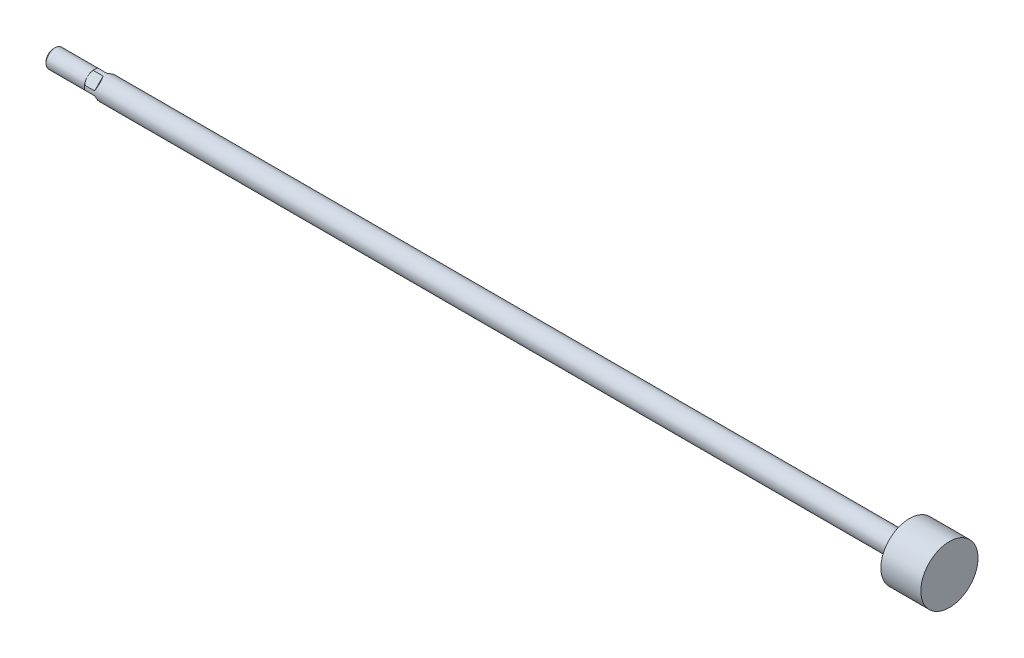
ISO-10303-21;
HEADER;
FILE_DESCRIPTION(('STEP AP214'),'2;1');
FILE_NAME('part.step','',(''),(''),'','','');
FILE_SCHEMA(('AUTOMOTIVE_DESIGN { 1 0 10303 214 1 1 1 1 }'));
ENDSEC;
DATA;
#1=APPLICATION_CONTEXT('core data for automotive mechanical design processes');
#2=APPLICATION_PROTOCOL_DEFINITION('international standard','automotive_design',2000,#1);
#3=PRODUCT_CONTEXT('',#1,'mechanical');
#4=PRODUCT('Part','Part','',(#3));
#5=PRODUCT_RELATED_PRODUCT_CATEGORY('part','',(#4));
#6=PRODUCT_DEFINITION_FORMATION('','',#4);
#7=PRODUCT_DEFINITION_CONTEXT('part definition',#1,'design');
#8=PRODUCT_DEFINITION('design','',#6,#7);
#9=PRODUCT_DEFINITION_SHAPE('','',#8);
#10=(LENGTH_UNIT() NAMED_UNIT(*) SI_UNIT(.MILLI.,.METRE.));
#11=(NAMED_UNIT(*) PLANE_ANGLE_UNIT() SI_UNIT($,.RADIAN.));
#12=(NAMED_UNIT(*) SI_UNIT($,.STERADIAN.) SOLID_ANGLE_UNIT());
#13=UNCERTAINTY_MEASURE_WITH_UNIT(LENGTH_MEASURE(1.E-05),#10,'distance_accuracy_value','');
#14=(GEOMETRIC_REPRESENTATION_CONTEXT(3) GLOBAL_UNCERTAINTY_ASSIGNED_CONTEXT((#13)) GLOBAL_UNIT_ASSIGNED_CONTEXT((#10,
#11,#12)) REPRESENTATION_CONTEXT('',''));
#15=CARTESIAN_POINT('',(0.,0.,0.));
#16=DIRECTION('',(0.,0.,1.));
#17=DIRECTION('',(1.,0.,0.));
#18=AXIS2_PLACEMENT_3D('',#15,#16,#17);
#19=CARTESIAN_POINT('',(23.,0.,0.));
#20=DIRECTION('',(1.,0.,0.));
#21=DIRECTION('',(0.,0.,-1.));
#22=AXIS2_PLACEMENT_3D('',#19,#20,#21);
#23=CONICAL_SURFACE('',#22,5.99999999999999,0.785398163397445);
#24=CARTESIAN_POINT('',(23.,0.,0.));
#25=DIRECTION('',(-1.,0.,0.));
#26=DIRECTION('',(0.,0.,1.));
#27=AXIS2_PLACEMENT_3D('',#24,#25,#26);
#28=CIRCLE('',#27,5.99999999999999);
#29=CARTESIAN_POINT('',(23.,-5.88074178584445,-1.19032602602103));
#30=VERTEX_POINT('',#29);
#31=CARTESIAN_POINT('',(23.,-5.88074178584444,1.19032602602103));
#32=VERTEX_POINT('',#31);
#33=EDGE_CURVE('E207',#30,#32,#28,.T.);
#34=ORIENTED_EDGE('',*,*,#33,.T.);
#35=CARTESIAN_POINT('',(23.0002,-5.88099761701418,1.19007019485129));
#36=CARTESIAN_POINT('',(22.9510440724068,-5.81811483877079,1.25295297309469));
#37=CARTESIAN_POINT('',(22.9029313524006,-5.75482507418754,1.31624273767794));
#38=CARTESIAN_POINT('',(22.8090823894487,-5.62734850641512,1.44371930545035));
#39=CARTESIAN_POINT('',(22.7633468355185,-5.56316144991378,1.5079063619517));
#40=CARTESIAN_POINT('',(22.6298425181199,-5.36868839423572,1.70237941762975));
#41=CARTESIAN_POINT('',(22.5461580251507,-5.23697199461113,1.83409581725435));
#42=CARTESIAN_POINT('',(22.3921031533509,-4.96822727016499,2.10284054170049));
#43=CARTESIAN_POINT('',(22.3218635701848,-4.83116098734405,2.23990682452143));
#44=CARTESIAN_POINT('',(22.1996463430325,-4.55314819356125,2.51791961830423));
#45=CARTESIAN_POINT('',(22.1476398226633,-4.41220820286018,2.6588596090053));
#46=CARTESIAN_POINT('',(22.076734746217,-4.16562053549287,2.9054472763726));
#47=CARTESIAN_POINT('',(22.0526890191447,-4.06071275132046,3.01035506054501));
#48=CARTESIAN_POINT('',(22.0175298585743,-3.84979184907856,3.22127596278691));
#49=CARTESIAN_POINT('',(22.0064169654416,-3.7437786850103,3.32728912685517));
#50=CARTESIAN_POINT('',(21.9977783521526,-3.53213647013354,3.53893134173194));
#51=CARTESIAN_POINT('',(22.0001680259723,-3.42650916818231,3.64455864368317));
#52=CARTESIAN_POINT('',(22.0181960610271,-3.21582855252734,3.85523925933814));
#53=CARTESIAN_POINT('',(22.0338352417217,-3.1107752747305,3.96029253713497));
#54=CARTESIAN_POINT('',(22.0830231598923,-2.87582236565578,4.19524544620969));
#55=CARTESIAN_POINT('',(22.1200764012196,-2.74628952530572,4.32477828655975));
#56=CARTESIAN_POINT('',(22.2110065453868,-2.49021090718481,4.58085690468066));
#57=CARTESIAN_POINT('',(22.2648923193015,-2.36366674241764,4.70740106944784));
#58=CARTESIAN_POINT('',(22.386785732996,-2.11334572452889,4.95772208733659));
#59=CARTESIAN_POINT('',(22.4548649705229,-1.989586569211,5.08148124265448));
#60=CARTESIAN_POINT('',(22.6021483972448,-1.74549978196564,5.32556802989984));
#61=CARTESIAN_POINT('',(22.6813495208955,-1.62517121541694,5.44589659644854));
#62=CARTESIAN_POINT('',(22.8025857634105,-1.45295236100189,5.61811545086358));
#63=CARTESIAN_POINT('',(22.8411147424624,-1.39980646766215,5.67126134420333));
#64=CARTESIAN_POINT('',(22.9195954983845,-1.29437286498691,5.77669494687857));
#65=CARTESIAN_POINT('',(22.9595394195067,-1.24208223430455,5.82898557756093));
#66=CARTESIAN_POINT('',(23.0002,-1.19007019485129,5.88099761701419));
#67=B_SPLINE_CURVE_WITH_KNOTS('',3,(#35,#36,#37,#38,#39,#40,#41,#42,#43,#44,#45,#46,#47,#48,#49,
#50,#51,#52,#53,#54,#55,#56,#57,#58,#59,#60,#61,#62,#63,#64,#65,#66),.UNSPECIFIED.,.F.,.F.,(4,2,
2,2,2,2,2,2,2,2,2,2,2,2,2,4),(0.,0.304819578685165,0.609727021411994,1.22188083188482,
1.83971682595719,2.45656986235395,2.90695888785131,3.35736673103194,3.80495549641761,
4.2525719464311,4.81229509723279,5.37231373221707,5.93522881986322,6.49798905371364,
6.75135396448927,7.00348316582242),.UNSPECIFIED.);
#68=CARTESIAN_POINT('',(22.,-3.53553390593274,3.53553390593274));
#69=VERTEX_POINT('',#68);
#70=EDGE_CURVE('E245',#32,#69,#67,.T.);
#71=ORIENTED_EDGE('',*,*,#70,.T.);
#72=CARTESIAN_POINT('',(22.,0.,0.));
#73=DIRECTION('',(-1.,0.,0.));
#74=DIRECTION('',(0.,0.,1.));
#75=AXIS2_PLACEMENT_3D('',#72,#73,#74);
#76=CIRCLE('',#75,5.);
#77=CARTESIAN_POINT('',(22.,-3.53553390593274,-3.53553390593274));
#78=VERTEX_POINT('',#77);
#79=EDGE_CURVE('E216',#78,#69,#76,.T.);
#80=ORIENTED_EDGE('',*,*,#79,.F.);
#81=CARTESIAN_POINT('',(23.0002,-1.19007019485129,-5.88099761701418));
#82=CARTESIAN_POINT('',(22.9510440724068,-1.25295297309469,-5.81811483877079));
#83=CARTESIAN_POINT('',(22.9029313524006,-1.31624273767794,-5.75482507418754));
#84=CARTESIAN_POINT('',(22.8090823894487,-1.44371930545035,-5.62734850641512));
#85=CARTESIAN_POINT('',(22.7633468355185,-1.50790636195169,-5.56316144991378));
#86=CARTESIAN_POINT('',(22.6298425181199,-1.70237941762975,-5.36868839423572));
#87=CARTESIAN_POINT('',(22.5461580251507,-1.83409581725435,-5.23697199461113));
#88=CARTESIAN_POINT('',(22.3921031533509,-2.10284054170049,-4.96822727016499));
#89=CARTESIAN_POINT('',(22.3218635701848,-2.23990682452143,-4.83116098734405));
#90=CARTESIAN_POINT('',(22.1996463430325,-2.51791961830422,-4.55314819356125));
#91=CARTESIAN_POINT('',(22.1476398226633,-2.6588596090053,-4.41220820286018));
#92=CARTESIAN_POINT('',(22.076734746217,-2.9054472763726,-4.16562053549287));
#93=CARTESIAN_POINT('',(22.0526890191447,-3.01035506054501,-4.06071275132046));
#94=CARTESIAN_POINT('',(22.0175298585743,-3.22127596278691,-3.84979184907856));
#95=CARTESIAN_POINT('',(22.0064169654416,-3.32728912685517,-3.7437786850103));
#96=CARTESIAN_POINT('',(21.9977783521526,-3.53893134173194,-3.53213647013354));
#97=CARTESIAN_POINT('',(22.0001680259723,-3.64455864368317,-3.42650916818231));
#98=CARTESIAN_POINT('',(22.0181960610271,-3.85523925933814,-3.21582855252734));
#99=CARTESIAN_POINT('',(22.0338352417217,-3.96029253713497,-3.1107752747305));
#100=CARTESIAN_POINT('',(22.0830231598923,-4.19524544620969,-2.87582236565578));
#101=CARTESIAN_POINT('',(22.1200764012196,-4.32477828655975,-2.74628952530572));
#102=CARTESIAN_POINT('',(22.2110065453868,-4.58085690468066,-2.49021090718481));
#103=CARTESIAN_POINT('',(22.2648923193015,-4.70740106944784,-2.36366674241764));
#104=CARTESIAN_POINT('',(22.386785732996,-4.95772208733659,-2.11334572452889));
#105=CARTESIAN_POINT('',(22.4548649705229,-5.08148124265448,-1.989586569211));
#106=CARTESIAN_POINT('',(22.6021483972448,-5.32556802989984,-1.74549978196564));
#107=CARTESIAN_POINT('',(22.6813495208955,-5.44589659644854,-1.62517121541694));
#108=CARTESIAN_POINT('',(22.8025857634105,-5.61811545086358,-1.45295236100189));
#109=CARTESIAN_POINT('',(22.8411147424624,-5.67126134420333,-1.39980646766215));
#110=CARTESIAN_POINT('',(22.9195954983845,-5.77669494687857,-1.29437286498691));
#111=CARTESIAN_POINT('',(22.9595394195067,-5.82898557756092,-1.24208223430455));
#112=CARTESIAN_POINT('',(23.0002,-5.88099761701419,-1.19007019485129));
#113=B_SPLINE_CURVE_WITH_KNOTS('',3,(#81,#82,#83,#84,#85,#86,#87,#88,#89,#90,#91,#92,#93,#94,
#95,#96,#97,#98,#99,#100,#101,#102,#103,#104,#105,#106,#107,#108,#109,#110,#111,#112),
.UNSPECIFIED.,.F.,.F.,(4,2,2,2,2,2,2,2,2,2,2,2,2,2,2,4),(0.,0.304819578685165,0.609727021411994,
1.22188083188482,1.83971682595719,2.45656986235395,2.90695888785131,3.35736673103194,
3.80495549641761,4.2525719464311,4.81229509723279,5.37231373221707,5.93522881986322,
6.49798905371364,6.75135396448927,7.00348316582242),.UNSPECIFIED.);
#114=EDGE_CURVE('E192',#78,#30,#113,.T.);
#115=ORIENTED_EDGE('',*,*,#114,.T.);
#116=EDGE_LOOP('',(#34,#71,#80,#115));
#117=FACE_BOUND('',#116,.T.);
#118=ADVANCED_FACE('F37',(#117),#23,.T.);
#119=CARTESIAN_POINT('',(23.,5.88074178584445,1.19032602602103));
#120=VERTEX_POINT('',#119);
#121=CARTESIAN_POINT('',(23.,5.88074178584444,-1.19032602602103));
#122=VERTEX_POINT('',#121);
#123=EDGE_CURVE('E209',#120,#122,#28,.T.);
#124=ORIENTED_EDGE('',*,*,#123,.T.);
#125=CARTESIAN_POINT('',(23.0002,5.88099761701418,-1.19007019485129));
#126=CARTESIAN_POINT('',(22.9510440724068,5.81811483877079,-1.25295297309469));
#127=CARTESIAN_POINT('',(22.9029313524006,5.75482507418754,-1.31624273767794));
#128=CARTESIAN_POINT('',(22.8090823894487,5.62734850641512,-1.44371930545035));
#129=CARTESIAN_POINT('',(22.7633468355185,5.56316144991378,-1.5079063619517));
#130=CARTESIAN_POINT('',(22.6298425181199,5.36868839423572,-1.70237941762975));
#131=CARTESIAN_POINT('',(22.5461580251507,5.23697199461113,-1.83409581725435));
#132=CARTESIAN_POINT('',(22.3921031533509,4.96822727016499,-2.10284054170049));
#133=CARTESIAN_POINT('',(22.3218635701848,4.83116098734405,-2.23990682452143));
#134=CARTESIAN_POINT('',(22.1996463430325,4.55314819356125,-2.51791961830423));
#135=CARTESIAN_POINT('',(22.1476398226633,4.41220820286018,-2.6588596090053));
#136=CARTESIAN_POINT('',(22.076734746217,4.16562053549287,-2.9054472763726));
#137=CARTESIAN_POINT('',(22.0526890191447,4.06071275132046,-3.01035506054501));
#138=CARTESIAN_POINT('',(22.0175298585743,3.84979184907856,-3.22127596278691));
#139=CARTESIAN_POINT('',(22.0064169654416,3.7437786850103,-3.32728912685517));
#140=CARTESIAN_POINT('',(21.9977783521526,3.53213647013354,-3.53893134173194));
#141=CARTESIAN_POINT('',(22.0001680259723,3.42650916818231,-3.64455864368317));
#142=CARTESIAN_POINT('',(22.0181960610271,3.21582855252734,-3.85523925933813));
#143=CARTESIAN_POINT('',(22.0338352417217,3.1107752747305,-3.96029253713497));
#144=CARTESIAN_POINT('',(22.0830231598923,2.87582236565578,-4.19524544620969));
#145=CARTESIAN_POINT('',(22.1200764012196,2.74628952530573,-4.32477828655975));
#146=CARTESIAN_POINT('',(22.2110065453868,2.49021090718481,-4.58085690468066));
#147=CARTESIAN_POINT('',(22.2648923193015,2.36366674241764,-4.70740106944784));
#148=CARTESIAN_POINT('',(22.386785732996,2.11334572452889,-4.95772208733659));
#149=CARTESIAN_POINT('',(22.4548649705229,1.989586569211,-5.08148124265448));
#150=CARTESIAN_POINT('',(22.6021483972448,1.74549978196564,-5.32556802989984));
#151=CARTESIAN_POINT('',(22.6813495208955,1.62517121541694,-5.44589659644854));
#152=CARTESIAN_POINT('',(22.8025857634105,1.4529523610019,-5.61811545086358));
#153=CARTESIAN_POINT('',(22.8411147424624,1.39980646766215,-5.67126134420333));
#154=CARTESIAN_POINT('',(22.9195954983845,1.29437286498691,-5.77669494687856));
#155=CARTESIAN_POINT('',(22.9595394195067,1.24208223430455,-5.82898557756092));
#156=CARTESIAN_POINT('',(23.0002,1.19007019485129,-5.88099761701419));
#157=B_SPLINE_CURVE_WITH_KNOTS('',3,(#125,#126,#127,#128,#129,#130,#131,#132,#133,#134,#135,
#136,#137,#138,#139,#140,#141,#142,#143,#144,#145,#146,#147,#148,#149,#150,#151,#152,#153,#154,
#155,#156),.UNSPECIFIED.,.F.,.F.,(4,2,2,2,2,2,2,2,2,2,2,2,2,2,2,4),(0.,0.304819578685164,
0.609727021411993,1.22188083188482,1.83971682595719,2.45656986235395,2.9069588878513,
3.35736673103194,3.80495549641761,4.2525719464311,4.81229509723279,5.37231373221707,
5.93522881986322,6.49798905371364,6.75135396448926,7.00348316582241),.UNSPECIFIED.);
#158=CARTESIAN_POINT('',(22.,3.53553390593274,-3.53553390593274));
#159=VERTEX_POINT('',#158);
#160=EDGE_CURVE('E144',#122,#159,#157,.T.);
#161=ORIENTED_EDGE('',*,*,#160,.T.);
#162=CARTESIAN_POINT('',(22.,3.53553390593274,3.53553390593274));
#163=VERTEX_POINT('',#162);
#164=EDGE_CURVE('E210',#163,#159,#76,.T.);
#165=ORIENTED_EDGE('',*,*,#164,.F.);
#166=CARTESIAN_POINT('',(23.0002,1.19007019485129,5.88099761701418));
#167=CARTESIAN_POINT('',(22.9510440724068,1.25295297309469,5.81811483877079));
#168=CARTESIAN_POINT('',(22.9029313524006,1.31624273767794,5.75482507418753));
#169=CARTESIAN_POINT('',(22.8090823894487,1.44371930545035,5.62734850641512));
#170=CARTESIAN_POINT('',(22.7633468355185,1.5079063619517,5.56316144991378));
#171=CARTESIAN_POINT('',(22.6298425181199,1.70237941762975,5.36868839423572));
#172=CARTESIAN_POINT('',(22.5461580251507,1.83409581725435,5.23697199461112));
#173=CARTESIAN_POINT('',(22.3921031533509,2.10284054170049,4.96822727016498));
#174=CARTESIAN_POINT('',(22.3218635701848,2.23990682452143,4.83116098734405));
#175=CARTESIAN_POINT('',(22.1996463430325,2.51791961830423,4.55314819356125));
#176=CARTESIAN_POINT('',(22.1476398226633,2.6588596090053,4.41220820286018));
#177=CARTESIAN_POINT('',(22.076734746217,2.90544727637261,4.16562053549287));
#178=CARTESIAN_POINT('',(22.0526890191447,3.01035506054502,4.06071275132046));
#179=CARTESIAN_POINT('',(22.0175298585743,3.22127596278691,3.84979184907856));
#180=CARTESIAN_POINT('',(22.0064169654416,3.32728912685517,3.7437786850103));
#181=CARTESIAN_POINT('',(21.9977783521526,3.53893134173194,3.53213647013354));
#182=CARTESIAN_POINT('',(22.0001680259723,3.64455864368317,3.42650916818231));
#183=CARTESIAN_POINT('',(22.0181960610271,3.85523925933814,3.21582855252734));
#184=CARTESIAN_POINT('',(22.0338352417217,3.96029253713497,3.1107752747305));
#185=CARTESIAN_POINT('',(22.0830231598923,4.1952454462097,2.87582236565578));
#186=CARTESIAN_POINT('',(22.1200764012196,4.32477828655975,2.74628952530572));
#187=CARTESIAN_POINT('',(22.2110065453868,4.58085690468066,2.49021090718481));
#188=CARTESIAN_POINT('',(22.2648923193015,4.70740106944784,2.36366674241764));
#189=CARTESIAN_POINT('',(22.386785732996,4.95772208733659,2.11334572452888));
#190=CARTESIAN_POINT('',(22.4548649705229,5.08148124265448,1.989586569211));
#191=CARTESIAN_POINT('',(22.6021483972448,5.32556802989984,1.74549978196563));
#192=CARTESIAN_POINT('',(22.6813495208955,5.44589659644854,1.62517121541693));
#193=CARTESIAN_POINT('',(22.8025857634105,5.61811545086359,1.45295236100189));
#194=CARTESIAN_POINT('',(22.8411147424624,5.67126134420333,1.39980646766215));
#195=CARTESIAN_POINT('',(22.9195954983845,5.77669494687857,1.29437286498691));
#196=CARTESIAN_POINT('',(22.9595394195067,5.82898557756092,1.24208223430455));
#197=CARTESIAN_POINT('',(23.0002,5.88099761701419,1.19007019485129));
#198=B_SPLINE_CURVE_WITH_KNOTS('',3,(#166,#167,#168,#169,#170,#171,#172,#173,#174,#175,#176,
#177,#178,#179,#180,#181,#182,#183,#184,#185,#186,#187,#188,#189,#190,#191,#192,#193,#194,#195,
#196,#197),.UNSPECIFIED.,.F.,.F.,(4,2,2,2,2,2,2,2,2,2,2,2,2,2,2,4),(0.,0.304819578685165,
0.609727021411994,1.22188083188483,1.83971682595719,2.45656986235395,2.90695888785131,
3.35736673103194,3.80495549641761,4.2525719464311,4.81229509723279,5.37231373221707,
5.93522881986323,6.49798905371364,6.75135396448926,7.00348316582241),.UNSPECIFIED.);
#199=EDGE_CURVE('E183',#163,#120,#198,.T.);
#200=ORIENTED_EDGE('',*,*,#199,.T.);
#201=EDGE_LOOP('',(#124,#161,#165,#200));
#202=FACE_BOUND('',#201,.T.);
#203=ADVANCED_FACE('F259',(#202),#23,.T.);
#204=EDGE_CURVE('E215',#69,#163,#76,.T.);
#205=ORIENTED_EDGE('',*,*,#204,.F.);
#206=CARTESIAN_POINT('',(23.,-1.19032602602103,5.88074178584445));
#207=VERTEX_POINT('',#206);
#208=EDGE_CURVE('E152',#69,#207,#67,.T.);
#209=ORIENTED_EDGE('',*,*,#208,.T.);
#210=CARTESIAN_POINT('',(23.,1.19032602602103,5.88074178584444));
#211=VERTEX_POINT('',#210);
#212=EDGE_CURVE('E206',#207,#211,#28,.T.);
#213=ORIENTED_EDGE('',*,*,#212,.T.);
#214=EDGE_CURVE('E190',#211,#163,#198,.T.);
#215=ORIENTED_EDGE('',*,*,#214,.T.);
#216=EDGE_LOOP('',(#205,#209,#213,#215));
#217=FACE_BOUND('',#216,.T.);
#218=ADVANCED_FACE('F268',(#217),#23,.T.);
#219=CARTESIAN_POINT('',(0.,0.,0.));
#220=DIRECTION('',(1.,0.,0.));
#221=DIRECTION('',(0.,0.,-1.));
#222=AXIS2_PLACEMENT_3D('',#219,#220,#221);
#223=PLANE('',#222);
#224=CARTESIAN_POINT('',(0.,0.,0.));
#225=DIRECTION('',(-1.,0.,0.));
#226=DIRECTION('',(0.,0.,1.));
#227=AXIS2_PLACEMENT_3D('',#224,#225,#226);
#228=CIRCLE('',#227,4.233);
#229=CARTESIAN_POINT('',(0.,0.,4.233));
#230=VERTEX_POINT('',#229);
#231=EDGE_CURVE('E219',#230,#230,#228,.T.);
#232=ORIENTED_EDGE('',*,*,#231,.T.);
#233=EDGE_LOOP('',(#232));
#234=FACE_BOUND('',#233,.T.);
#235=ADVANCED_FACE('F39',(#234),#223,.F.);
#236=CARTESIAN_POINT('',(0.767000000000018,0.,0.));
#237=DIRECTION('',(1.,0.,0.));
#238=DIRECTION('',(0.,0.,-1.));
#239=AXIS2_PLACEMENT_3D('',#236,#237,#238);
#240=CONICAL_SURFACE('',#239,5.,0.785398163397437);
#241=ORIENTED_EDGE('',*,*,#231,.F.);
#242=EDGE_LOOP('',(#241));
#243=FACE_BOUND('',#242,.T.);
#244=CARTESIAN_POINT('',(0.767000000000018,0.,0.));
#245=DIRECTION('',(-1.,0.,0.));
#246=DIRECTION('',(0.,0.,1.));
#247=AXIS2_PLACEMENT_3D('',#244,#245,#246);
#248=CIRCLE('',#247,5.);
#249=CARTESIAN_POINT('',(0.767000000000018,0.,5.));
#250=VERTEX_POINT('',#249);
#251=EDGE_CURVE('E213',#250,#250,#248,.T.);
#252=ORIENTED_EDGE('',*,*,#251,.T.);
#253=EDGE_LOOP('',(#252));
#254=FACE_BOUND('',#253,.T.);
#255=ADVANCED_FACE('F290',(#243,#254),#240,.T.);
#256=CARTESIAN_POINT('',(493.,0.,0.));
#257=DIRECTION('',(-1.,0.,0.));
#258=DIRECTION('',(0.,0.,1.));
#259=AXIS2_PLACEMENT_3D('',#256,#257,#258);
#260=CYLINDRICAL_SURFACE('',#259,5.);
#261=ORIENTED_EDGE('',*,*,#251,.F.);
#262=EDGE_LOOP('',(#261));
#263=FACE_BOUND('',#262,.T.);
#264=ORIENTED_EDGE('',*,*,#164,.T.);
#265=EDGE_CURVE('E214',#159,#78,#76,.T.);
#266=ORIENTED_EDGE('',*,*,#265,.T.);
#267=ORIENTED_EDGE('',*,*,#79,.T.);
#268=ORIENTED_EDGE('',*,*,#204,.T.);
#269=EDGE_LOOP('',(#264,#266,#267,#268));
#270=FACE_BOUND('',#269,.T.);
#271=ADVANCED_FACE('F267',(#263,#270),#260,.T.);
#272=ORIENTED_EDGE('',*,*,#265,.F.);
#273=CARTESIAN_POINT('',(23.,1.19032602602103,-5.88074178584445));
#274=VERTEX_POINT('',#273);
#275=EDGE_CURVE('E142',#159,#274,#157,.T.);
#276=ORIENTED_EDGE('',*,*,#275,.T.);
#277=CARTESIAN_POINT('',(23.,-1.19032602602103,-5.88074178584444));
#278=VERTEX_POINT('',#277);
#279=EDGE_CURVE('E130',#274,#278,#28,.T.);
#280=ORIENTED_EDGE('',*,*,#279,.T.);
#281=EDGE_CURVE('E191',#278,#78,#113,.T.);
#282=ORIENTED_EDGE('',*,*,#281,.T.);
#283=EDGE_LOOP('',(#272,#276,#280,#282));
#284=FACE_BOUND('',#283,.T.);
#285=ADVANCED_FACE('F158',(#284),#23,.T.);
#286=CARTESIAN_POINT('',(493.,0.,0.));
#287=DIRECTION('',(-1.,0.,0.));
#288=DIRECTION('',(0.,0.,1.));
#289=AXIS2_PLACEMENT_3D('',#286,#287,#288);
#290=CYLINDRICAL_SURFACE('',#289,6.);
#291=CARTESIAN_POINT('',(23.3999999999999,0.,0.));
#292=DIRECTION('',(0.707106781186547,0.5,-0.5));
#293=DIRECTION('',(-0.707106781186548,0.5,-0.5));
#294=AXIS2_PLACEMENT_3D('',#291,#292,#293);
#295=ELLIPSE('',#294,8.48528137423857,6.);
#296=CARTESIAN_POINT('',(28.4,-1.19032602602103,5.88074178584445));
#297=VERTEX_POINT('',#296);
#298=CARTESIAN_POINT('',(28.4,-5.88074178584445,1.19032602602103));
#299=VERTEX_POINT('',#298);
#300=EDGE_CURVE('E45',#297,#299,#295,.T.);
#301=ORIENTED_EDGE('',*,*,#300,.T.);
#302=DIRECTION('',(-1.,0.,0.));
#303=VECTOR('',#302,1.);
#304=CARTESIAN_POINT('',(493.,-5.88074178584445,1.19032602602103));
#305=LINE('',#304,#303);
#306=EDGE_CURVE('E11',#299,#32,#305,.T.);
#307=ORIENTED_EDGE('',*,*,#306,.T.);
#308=ORIENTED_EDGE('',*,*,#33,.F.);
#309=DIRECTION('',(-1.,0.,0.));
#310=VECTOR('',#309,1.);
#311=CARTESIAN_POINT('',(493.,-5.88074178584445,-1.19032602602103));
#312=LINE('',#311,#310);
#313=CARTESIAN_POINT('',(28.4,-5.88074178584444,-1.19032602602104));
#314=VERTEX_POINT('',#313);
#315=EDGE_CURVE('E225',#30,#314,#312,.F.);
#316=ORIENTED_EDGE('',*,*,#315,.T.);
#317=CARTESIAN_POINT('',(23.4,0.,0.));
#318=DIRECTION('',(0.707106781186547,0.5,0.5));
#319=DIRECTION('',(-0.707106781186548,0.5,0.5));
#320=AXIS2_PLACEMENT_3D('',#317,#318,#319);
#321=ELLIPSE('',#320,8.48528137423857,6.);
#322=CARTESIAN_POINT('',(28.4,-1.19032602602104,-5.88074178584444));
#323=VERTEX_POINT('',#322);
#324=EDGE_CURVE('E222',#314,#323,#321,.T.);
#325=ORIENTED_EDGE('',*,*,#324,.T.);
#326=DIRECTION('',(-1.,0.,0.));
#327=VECTOR('',#326,1.);
#328=CARTESIAN_POINT('',(493.,-1.19032602602103,-5.88074178584445));
#329=LINE('',#328,#327);
#330=EDGE_CURVE('E228',#323,#278,#329,.T.);
#331=ORIENTED_EDGE('',*,*,#330,.T.);
#332=ORIENTED_EDGE('',*,*,#279,.F.);
#333=DIRECTION('',(-1.,0.,0.));
#334=VECTOR('',#333,1.);
#335=CARTESIAN_POINT('',(493.,1.19032602602103,-5.88074178584445));
#336=LINE('',#335,#334);
#337=CARTESIAN_POINT('',(28.4,1.19032602602104,-5.88074178584444));
#338=VERTEX_POINT('',#337);
#339=EDGE_CURVE('E117',#274,#338,#336,.F.);
#340=ORIENTED_EDGE('',*,*,#339,.T.);
#341=CARTESIAN_POINT('',(23.4,0.,0.));
#342=DIRECTION('',(0.707106781186547,-0.5,0.5));
#343=DIRECTION('',(-0.707106781186548,-0.5,0.5));
#344=AXIS2_PLACEMENT_3D('',#341,#342,#343);
#345=ELLIPSE('',#344,8.48528137423857,6.);
#346=CARTESIAN_POINT('',(28.4,5.88074178584443,-1.19032602602104));
#347=VERTEX_POINT('',#346);
#348=EDGE_CURVE('E112',#338,#347,#345,.T.);
#349=ORIENTED_EDGE('',*,*,#348,.T.);
#350=DIRECTION('',(-1.,0.,0.));
#351=VECTOR('',#350,1.);
#352=CARTESIAN_POINT('',(493.,5.88074178584445,-1.19032602602103));
#353=LINE('',#352,#351);
#354=EDGE_CURVE('E123',#347,#122,#353,.T.);
#355=ORIENTED_EDGE('',*,*,#354,.T.);
#356=ORIENTED_EDGE('',*,*,#123,.F.);
#357=DIRECTION('',(-1.,0.,0.));
#358=VECTOR('',#357,1.);
#359=CARTESIAN_POINT('',(493.,5.88074178584445,1.19032602602103));
#360=LINE('',#359,#358);
#361=CARTESIAN_POINT('',(28.4,5.88074178584445,1.19032602602103));
#362=VERTEX_POINT('',#361);
#363=EDGE_CURVE('E230',#120,#362,#360,.F.);
#364=ORIENTED_EDGE('',*,*,#363,.T.);
#365=CARTESIAN_POINT('',(23.3999999999999,0.,0.));
#366=DIRECTION('',(0.707106781186547,-0.5,-0.5));
#367=DIRECTION('',(-0.707106781186548,-0.5,-0.5));
#368=AXIS2_PLACEMENT_3D('',#365,#366,#367);
#369=ELLIPSE('',#368,8.48528137423857,6.);
#370=CARTESIAN_POINT('',(28.4,1.19032602602103,5.88074178584445));
#371=VERTEX_POINT('',#370);
#372=EDGE_CURVE('E233',#362,#371,#369,.T.);
#373=ORIENTED_EDGE('',*,*,#372,.T.);
#374=DIRECTION('',(-1.,0.,0.));
#375=VECTOR('',#374,1.);
#376=CARTESIAN_POINT('',(493.,1.19032602602103,5.88074178584445));
#377=LINE('',#376,#375);
#378=EDGE_CURVE('E118',#371,#211,#377,.T.);
#379=ORIENTED_EDGE('',*,*,#378,.T.);
#380=ORIENTED_EDGE('',*,*,#212,.F.);
#381=DIRECTION('',(-1.,0.,0.));
#382=VECTOR('',#381,1.);
#383=CARTESIAN_POINT('',(493.,-1.19032602602103,5.88074178584445));
#384=LINE('',#383,#382);
#385=EDGE_CURVE('E132',#207,#297,#384,.F.);
#386=ORIENTED_EDGE('',*,*,#385,.T.);
#387=EDGE_LOOP('',(#301,#307,#308,#316,#325,#331,#332,#340,#349,#355,#356,#364,#373,#379,#380,#386));
#388=FACE_BOUND('',#387,.T.);
#389=CARTESIAN_POINT('',(471.,0.,0.));
#390=DIRECTION('',(-1.,0.,0.));
#391=DIRECTION('',(0.,0.,1.));
#392=AXIS2_PLACEMENT_3D('',#389,#390,#391);
#393=CIRCLE('',#392,6.);
#394=CARTESIAN_POINT('',(471.,0.,6.));
#395=VERTEX_POINT('',#394);
#396=EDGE_CURVE('E203',#395,#395,#393,.T.);
#397=ORIENTED_EDGE('',*,*,#396,.T.);
#398=EDGE_LOOP('',(#397));
#399=FACE_BOUND('',#398,.T.);
#400=ADVANCED_FACE('F127',(#388,#399),#290,.T.);
#401=CARTESIAN_POINT('',(471.,6.,0.));
#402=DIRECTION('',(1.,0.,0.));
#403=DIRECTION('',(0.,0.,-1.));
#404=AXIS2_PLACEMENT_3D('',#401,#402,#403);
#405=PLANE('',#404);
#406=ORIENTED_EDGE('',*,*,#396,.F.);
#407=EDGE_LOOP('',(#406));
#408=FACE_BOUND('',#407,.T.);
#409=CARTESIAN_POINT('',(471.,0.,0.));
#410=DIRECTION('',(-1.,0.,0.));
#411=DIRECTION('',(0.,0.,1.));
#412=AXIS2_PLACEMENT_3D('',#409,#410,#411);
#413=CIRCLE('',#412,15.75);
#414=CARTESIAN_POINT('',(471.,0.,15.75));
#415=VERTEX_POINT('',#414);
#416=EDGE_CURVE('E200',#415,#415,#413,.T.);
#417=ORIENTED_EDGE('',*,*,#416,.T.);
#418=EDGE_LOOP('',(#417));
#419=FACE_BOUND('',#418,.T.);
#420=ADVANCED_FACE('F289',(#408,#419),#405,.F.);
#421=CARTESIAN_POINT('',(493.,0.,0.));
#422=DIRECTION('',(-1.,0.,0.));
#423=DIRECTION('',(0.,0.,1.));
#424=AXIS2_PLACEMENT_3D('',#421,#422,#423);
#425=CYLINDRICAL_SURFACE('',#424,15.75);
#426=ORIENTED_EDGE('',*,*,#416,.F.);
#427=EDGE_LOOP('',(#426));
#428=FACE_BOUND('',#427,.T.);
#429=CARTESIAN_POINT('',(493.,0.,0.));
#430=DIRECTION('',(-1.,0.,0.));
#431=DIRECTION('',(0.,0.,1.));
#432=AXIS2_PLACEMENT_3D('',#429,#430,#431);
#433=CIRCLE('',#432,15.75);
#434=CARTESIAN_POINT('',(493.,0.,15.75));
#435=VERTEX_POINT('',#434);
#436=EDGE_CURVE('E197',#435,#435,#433,.T.);
#437=ORIENTED_EDGE('',*,*,#436,.T.);
#438=EDGE_LOOP('',(#437));
#439=FACE_BOUND('',#438,.T.);
#440=ADVANCED_FACE('F277',(#428,#439),#425,.T.);
#441=CARTESIAN_POINT('',(493.,15.75,0.));
#442=DIRECTION('',(-1.,0.,0.));
#443=DIRECTION('',(0.,0.,1.));
#444=AXIS2_PLACEMENT_3D('',#441,#442,#443);
#445=PLANE('',#444);
#446=ORIENTED_EDGE('',*,*,#436,.F.);
#447=EDGE_LOOP('',(#446));
#448=FACE_BOUND('',#447,.T.);
#449=ADVANCED_FACE('F272',(#448),#445,.F.);
#450=CARTESIAN_POINT('',(35.4,-4.94974746830583,-12.0208152801713));
#451=DIRECTION('',(0.707106781186547,0.5,0.5));
#452=DIRECTION('',(0.577350269189626,0.,-0.816496580927726));
#453=AXIS2_PLACEMENT_3D('',#450,#451,#452);
#454=PLANE('',#453);
#455=DIRECTION('',(0.,-0.707106781186548,0.707106781186547));
#456=VECTOR('',#455,1.);
#457=CARTESIAN_POINT('',(28.4,0.,-7.07106781186548));
#458=LINE('',#457,#456);
#459=EDGE_CURVE('E242',#323,#314,#458,.T.);
#460=ORIENTED_EDGE('',*,*,#459,.F.);
#461=ORIENTED_EDGE('',*,*,#324,.F.);
#462=EDGE_LOOP('',(#460,#461));
#463=FACE_BOUND('',#462,.T.);
#464=ADVANCED_FACE('F270',(#463),#454,.F.);
#465=CARTESIAN_POINT('',(28.4,0.,-7.07106781186548));
#466=DIRECTION('',(0.,0.707106781186547,0.707106781186548));
#467=DIRECTION('',(0.,-0.707106781186548,0.707106781186547));
#468=AXIS2_PLACEMENT_3D('',#465,#466,#467);
#469=PLANE('',#468);
#470=ORIENTED_EDGE('',*,*,#459,.T.);
#471=ORIENTED_EDGE('',*,*,#315,.F.);
#472=ORIENTED_EDGE('',*,*,#114,.F.);
#473=ORIENTED_EDGE('',*,*,#281,.F.);
#474=ORIENTED_EDGE('',*,*,#330,.F.);
#475=EDGE_LOOP('',(#470,#471,#472,#473,#474));
#476=FACE_BOUND('',#475,.T.);
#477=ADVANCED_FACE('F174',(#476),#469,.F.);
#478=CARTESIAN_POINT('',(28.4,7.07106781186548,0.));
#479=DIRECTION('',(0.707106781186547,-0.5,-0.5));
#480=DIRECTION('',(-0.577350269189626,0.,-0.816496580927726));
#481=AXIS2_PLACEMENT_3D('',#478,#479,#480);
#482=PLANE('',#481);
#483=DIRECTION('',(0.,-0.707106781186548,0.707106781186547));
#484=VECTOR('',#483,1.);
#485=CARTESIAN_POINT('',(28.4,7.07106781186548,0.));
#486=LINE('',#485,#484);
#487=EDGE_CURVE('E239',#362,#371,#486,.T.);
#488=ORIENTED_EDGE('',*,*,#487,.T.);
#489=ORIENTED_EDGE('',*,*,#372,.F.);
#490=EDGE_LOOP('',(#488,#489));
#491=FACE_BOUND('',#490,.T.);
#492=ADVANCED_FACE('F171',(#491),#482,.F.);
#493=CARTESIAN_POINT('',(22.,7.07106781186548,0.));
#494=DIRECTION('',(0.,-0.707106781186547,-0.707106781186548));
#495=DIRECTION('',(0.,0.707106781186548,-0.707106781186547));
#496=AXIS2_PLACEMENT_3D('',#493,#494,#495);
#497=PLANE('',#496);
#498=ORIENTED_EDGE('',*,*,#487,.F.);
#499=ORIENTED_EDGE('',*,*,#363,.F.);
#500=ORIENTED_EDGE('',*,*,#199,.F.);
#501=ORIENTED_EDGE('',*,*,#214,.F.);
#502=ORIENTED_EDGE('',*,*,#378,.F.);
#503=EDGE_LOOP('',(#498,#499,#500,#501,#502));
#504=FACE_BOUND('',#503,.T.);
#505=ADVANCED_FACE('F170',(#504),#497,.F.);
#506=CARTESIAN_POINT('',(35.4,12.0208152801713,-4.94974746830584));
#507=DIRECTION('',(0.707106781186547,-0.5,0.5));
#508=DIRECTION('',(0.577350269189626,0.,-0.816496580927726));
#509=AXIS2_PLACEMENT_3D('',#506,#507,#508);
#510=PLANE('',#509);
#511=DIRECTION('',(0.,-0.707106781186548,-0.707106781186547));
#512=VECTOR('',#511,1.);
#513=CARTESIAN_POINT('',(28.4,7.07106781186548,0.));
#514=LINE('',#513,#512);
#515=EDGE_CURVE('E59',#347,#338,#514,.T.);
#516=ORIENTED_EDGE('',*,*,#515,.F.);
#517=ORIENTED_EDGE('',*,*,#348,.F.);
#518=EDGE_LOOP('',(#516,#517));
#519=FACE_BOUND('',#518,.T.);
#520=ADVANCED_FACE('F113',(#519),#510,.F.);
#521=CARTESIAN_POINT('',(28.4,7.07106781186548,0.));
#522=DIRECTION('',(0.,-0.707106781186547,0.707106781186548));
#523=DIRECTION('',(0.,-0.707106781186548,-0.707106781186547));
#524=AXIS2_PLACEMENT_3D('',#521,#522,#523);
#525=PLANE('',#524);
#526=ORIENTED_EDGE('',*,*,#515,.T.);
#527=ORIENTED_EDGE('',*,*,#339,.F.);
#528=ORIENTED_EDGE('',*,*,#275,.F.);
#529=ORIENTED_EDGE('',*,*,#160,.F.);
#530=ORIENTED_EDGE('',*,*,#354,.F.);
#531=EDGE_LOOP('',(#526,#527,#528,#529,#530));
#532=FACE_BOUND('',#531,.T.);
#533=ADVANCED_FACE('F121',(#532),#525,.F.);
#534=CARTESIAN_POINT('',(28.4,0.,7.07106781186548));
#535=DIRECTION('',(0.707106781186547,0.5,-0.5));
#536=DIRECTION('',(-0.577350269189626,0.,-0.816496580927726));
#537=AXIS2_PLACEMENT_3D('',#534,#535,#536);
#538=PLANE('',#537);
#539=DIRECTION('',(0.,-0.707106781186548,-0.707106781186547));
#540=VECTOR('',#539,1.);
#541=CARTESIAN_POINT('',(28.4,0.,7.07106781186548));
#542=LINE('',#541,#540);
#543=EDGE_CURVE('E52',#297,#299,#542,.T.);
#544=ORIENTED_EDGE('',*,*,#543,.T.);
#545=ORIENTED_EDGE('',*,*,#300,.F.);
#546=EDGE_LOOP('',(#544,#545));
#547=FACE_BOUND('',#546,.T.);
#548=ADVANCED_FACE('F141',(#547),#538,.F.);
#549=CARTESIAN_POINT('',(22.,0.,7.07106781186548));
#550=DIRECTION('',(0.,0.707106781186547,-0.707106781186548));
#551=DIRECTION('',(0.,0.707106781186548,0.707106781186547));
#552=AXIS2_PLACEMENT_3D('',#549,#550,#551);
#553=PLANE('',#552);
#554=ORIENTED_EDGE('',*,*,#543,.F.);
#555=ORIENTED_EDGE('',*,*,#385,.F.);
#556=ORIENTED_EDGE('',*,*,#208,.F.);
#557=ORIENTED_EDGE('',*,*,#70,.F.);
#558=ORIENTED_EDGE('',*,*,#306,.F.);
#559=EDGE_LOOP('',(#554,#555,#556,#557,#558));
#560=FACE_BOUND('',#559,.T.);
#561=ADVANCED_FACE('F165',(#560),#553,.F.);
#562=CLOSED_SHELL('',(#118,#203,#218,#235,#255,#271,#285,#400,#420,#440,#449,#464,#477,#492,
#505,#520,#533,#548,#561));
#563=MANIFOLD_SOLID_BREP('B2',#562);
#564=ADVANCED_BREP_SHAPE_REPRESENTATION('',(#18,#563),#14);
#565=SHAPE_DEFINITION_REPRESENTATION(#9,#564);
ENDSEC;
END-ISO-10303-21;
